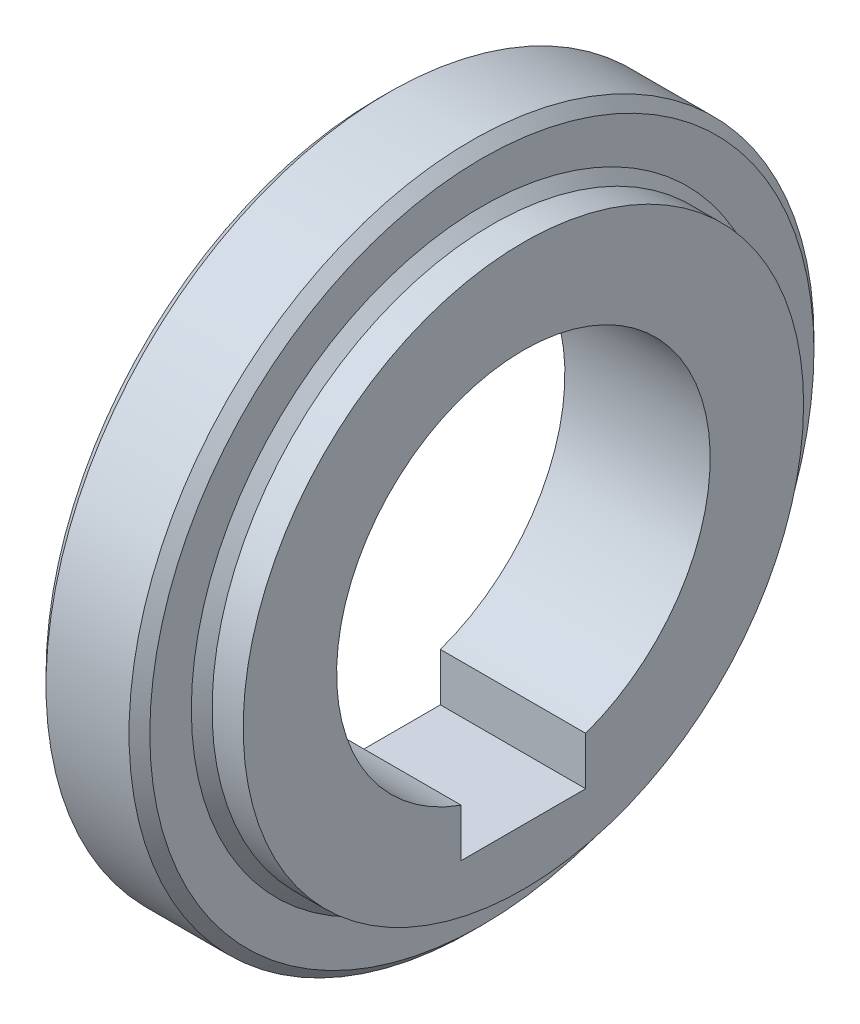
ISO-10303-21;
HEADER;
FILE_DESCRIPTION(('STEP AP214'),'2;1');
FILE_NAME('part.step','',(''),(''),'','','');
FILE_SCHEMA(('AUTOMOTIVE_DESIGN { 1 0 10303 214 1 1 1 1 }'));
ENDSEC;
DATA;
#1=APPLICATION_CONTEXT('core data for automotive mechanical design processes');
#2=APPLICATION_PROTOCOL_DEFINITION('international standard','automotive_design',2000,#1);
#3=PRODUCT_CONTEXT('',#1,'mechanical');
#4=PRODUCT('Part','Part','',(#3));
#5=PRODUCT_RELATED_PRODUCT_CATEGORY('part','',(#4));
#6=PRODUCT_DEFINITION_FORMATION('','',#4);
#7=PRODUCT_DEFINITION_CONTEXT('part definition',#1,'design');
#8=PRODUCT_DEFINITION('design','',#6,#7);
#9=PRODUCT_DEFINITION_SHAPE('','',#8);
#10=(LENGTH_UNIT() NAMED_UNIT(*) SI_UNIT(.MILLI.,.METRE.));
#11=(NAMED_UNIT(*) PLANE_ANGLE_UNIT() SI_UNIT($,.RADIAN.));
#12=(NAMED_UNIT(*) SI_UNIT($,.STERADIAN.) SOLID_ANGLE_UNIT());
#13=UNCERTAINTY_MEASURE_WITH_UNIT(LENGTH_MEASURE(1.E-05),#10,'distance_accuracy_value','');
#14=(GEOMETRIC_REPRESENTATION_CONTEXT(3) GLOBAL_UNCERTAINTY_ASSIGNED_CONTEXT((#13)) GLOBAL_UNIT_ASSIGNED_CONTEXT((#10,
#11,#12)) REPRESENTATION_CONTEXT('',''));
#15=CARTESIAN_POINT('',(0.,0.,0.));
#16=DIRECTION('',(0.,0.,1.));
#17=DIRECTION('',(1.,0.,0.));
#18=AXIS2_PLACEMENT_3D('',#15,#16,#17);
#19=CARTESIAN_POINT('',(0.,0.,0.));
#20=DIRECTION('',(1.,0.,0.));
#21=DIRECTION('',(0.,0.,-1.));
#22=AXIS2_PLACEMENT_3D('',#19,#20,#21);
#23=PLANE('',#22);
#24=CARTESIAN_POINT('',(0.,0.,0.));
#25=DIRECTION('',(1.,0.,0.));
#26=DIRECTION('',(0.,0.,-1.));
#27=AXIS2_PLACEMENT_3D('',#24,#25,#26);
#28=CIRCLE('',#27,16.);
#29=CARTESIAN_POINT('',(0.,0.,-16.));
#30=VERTEX_POINT('',#29);
#31=EDGE_CURVE('E93',#30,#30,#28,.F.);
#32=ORIENTED_EDGE('',*,*,#31,.T.);
#33=EDGE_LOOP('',(#32));
#34=FACE_BOUND('',#33,.T.);
#35=DIRECTION('',(0.,1.,0.));
#36=VECTOR('',#35,1.);
#37=CARTESIAN_POINT('',(0.,0.,-3.));
#38=LINE('',#37,#36);
#39=CARTESIAN_POINT('',(0.,-10.8,-3.));
#40=VERTEX_POINT('',#39);
#41=CARTESIAN_POINT('',(0.,-8.48528137423857,-3.));
#42=VERTEX_POINT('',#41);
#43=EDGE_CURVE('E60',#40,#42,#38,.T.);
#44=ORIENTED_EDGE('',*,*,#43,.T.);
#45=CARTESIAN_POINT('',(0.,0.,0.));
#46=DIRECTION('',(1.,0.,0.));
#47=DIRECTION('',(0.,0.,-1.));
#48=AXIS2_PLACEMENT_3D('',#45,#46,#47);
#49=CIRCLE('',#48,9.);
#50=CARTESIAN_POINT('',(0.,-8.48528137423857,3.));
#51=VERTEX_POINT('',#50);
#52=EDGE_CURVE('E71',#42,#51,#49,.T.);
#53=ORIENTED_EDGE('',*,*,#52,.T.);
#54=DIRECTION('',(0.,1.,0.));
#55=VECTOR('',#54,1.);
#56=CARTESIAN_POINT('',(0.,0.,3.));
#57=LINE('',#56,#55);
#58=CARTESIAN_POINT('',(0.,-10.8,3.));
#59=VERTEX_POINT('',#58);
#60=EDGE_CURVE('E32',#59,#51,#57,.T.);
#61=ORIENTED_EDGE('',*,*,#60,.F.);
#62=DIRECTION('',(0.,0.,1.));
#63=VECTOR('',#62,1.);
#64=CARTESIAN_POINT('',(0.,-10.8,0.));
#65=LINE('',#64,#63);
#66=EDGE_CURVE('E63',#40,#59,#65,.T.);
#67=ORIENTED_EDGE('',*,*,#66,.F.);
#68=EDGE_LOOP('',(#44,#53,#61,#67));
#69=FACE_BOUND('',#68,.T.);
#70=ADVANCED_FACE('F17',(#34,#69),#23,.F.);
#71=CARTESIAN_POINT('',(7.,0.,0.));
#72=DIRECTION('',(1.,0.,0.));
#73=DIRECTION('',(0.,0.,-1.));
#74=AXIS2_PLACEMENT_3D('',#71,#72,#73);
#75=PLANE('',#74);
#76=CARTESIAN_POINT('',(7.,0.,0.));
#77=DIRECTION('',(1.,0.,0.));
#78=DIRECTION('',(0.,0.,-1.));
#79=AXIS2_PLACEMENT_3D('',#76,#77,#78);
#80=CIRCLE('',#79,13.5);
#81=CARTESIAN_POINT('',(7.,0.,-13.5));
#82=VERTEX_POINT('',#81);
#83=EDGE_CURVE('E82',#82,#82,#80,.T.);
#84=ORIENTED_EDGE('',*,*,#83,.T.);
#85=EDGE_LOOP('',(#84));
#86=FACE_BOUND('',#85,.T.);
#87=CARTESIAN_POINT('',(7.,0.,0.));
#88=DIRECTION('',(1.,0.,0.));
#89=DIRECTION('',(0.,0.,-1.));
#90=AXIS2_PLACEMENT_3D('',#87,#88,#89);
#91=CIRCLE('',#90,9.);
#92=CARTESIAN_POINT('',(7.,-8.48528137423857,-3.));
#93=VERTEX_POINT('',#92);
#94=CARTESIAN_POINT('',(7.,-8.48528137423857,3.));
#95=VERTEX_POINT('',#94);
#96=EDGE_CURVE('E80',#93,#95,#91,.T.);
#97=ORIENTED_EDGE('',*,*,#96,.F.);
#98=DIRECTION('',(0.,-1.,0.));
#99=VECTOR('',#98,1.);
#100=CARTESIAN_POINT('',(7.,0.,-3.));
#101=LINE('',#100,#99);
#102=CARTESIAN_POINT('',(7.,-10.8,-3.));
#103=VERTEX_POINT('',#102);
#104=EDGE_CURVE('E77',#93,#103,#101,.T.);
#105=ORIENTED_EDGE('',*,*,#104,.T.);
#106=DIRECTION('',(0.,0.,-1.));
#107=VECTOR('',#106,1.);
#108=CARTESIAN_POINT('',(7.,-10.8,0.));
#109=LINE('',#108,#107);
#110=CARTESIAN_POINT('',(7.,-10.8,3.));
#111=VERTEX_POINT('',#110);
#112=EDGE_CURVE('E11',#111,#103,#109,.T.);
#113=ORIENTED_EDGE('',*,*,#112,.F.);
#114=DIRECTION('',(0.,-1.,0.));
#115=VECTOR('',#114,1.);
#116=CARTESIAN_POINT('',(7.,0.,3.));
#117=LINE('',#116,#115);
#118=EDGE_CURVE('E58',#95,#111,#117,.T.);
#119=ORIENTED_EDGE('',*,*,#118,.F.);
#120=EDGE_LOOP('',(#97,#105,#113,#119));
#121=FACE_BOUND('',#120,.T.);
#122=ADVANCED_FACE('F113',(#86,#121),#75,.T.);
#123=CARTESIAN_POINT('',(0.,0.,0.));
#124=DIRECTION('',(1.,0.,0.));
#125=DIRECTION('',(0.,0.,-1.));
#126=AXIS2_PLACEMENT_3D('',#123,#124,#125);
#127=CYLINDRICAL_SURFACE('',#126,9.);
#128=DIRECTION('',(1.,0.,0.));
#129=VECTOR('',#128,1.);
#130=CARTESIAN_POINT('',(0.,-8.48528137423857,-3.));
#131=LINE('',#130,#129);
#132=EDGE_CURVE('E25',#93,#42,#131,.F.);
#133=ORIENTED_EDGE('',*,*,#132,.F.);
#134=ORIENTED_EDGE('',*,*,#96,.T.);
#135=DIRECTION('',(1.,0.,0.));
#136=VECTOR('',#135,1.);
#137=CARTESIAN_POINT('',(0.,-8.48528137423857,3.));
#138=LINE('',#137,#136);
#139=EDGE_CURVE('E105',#95,#51,#138,.F.);
#140=ORIENTED_EDGE('',*,*,#139,.T.);
#141=ORIENTED_EDGE('',*,*,#52,.F.);
#142=EDGE_LOOP('',(#133,#134,#140,#141));
#143=FACE_BOUND('',#142,.T.);
#144=ADVANCED_FACE('F111',(#143),#127,.F.);
#145=CARTESIAN_POINT('',(5.,0.,0.));
#146=DIRECTION('',(-1.,0.,0.));
#147=DIRECTION('',(0.,0.,1.));
#148=AXIS2_PLACEMENT_3D('',#145,#146,#147);
#149=CYLINDRICAL_SURFACE('',#148,16.5);
#150=CARTESIAN_POINT('',(0.5,0.,0.));
#151=DIRECTION('',(1.,0.,0.));
#152=DIRECTION('',(0.,0.,-1.));
#153=AXIS2_PLACEMENT_3D('',#150,#151,#152);
#154=CIRCLE('',#153,16.5);
#155=CARTESIAN_POINT('',(0.5,0.,-16.5));
#156=VERTEX_POINT('',#155);
#157=EDGE_CURVE('E90',#156,#156,#154,.T.);
#158=ORIENTED_EDGE('',*,*,#157,.T.);
#159=EDGE_LOOP('',(#158));
#160=FACE_BOUND('',#159,.T.);
#161=CARTESIAN_POINT('',(4.5,0.,0.));
#162=DIRECTION('',(1.,0.,0.));
#163=DIRECTION('',(0.,0.,-1.));
#164=AXIS2_PLACEMENT_3D('',#161,#162,#163);
#165=CIRCLE('',#164,16.5);
#166=CARTESIAN_POINT('',(4.5,0.,-16.5));
#167=VERTEX_POINT('',#166);
#168=EDGE_CURVE('E87',#167,#167,#165,.F.);
#169=ORIENTED_EDGE('',*,*,#168,.T.);
#170=EDGE_LOOP('',(#169));
#171=FACE_BOUND('',#170,.T.);
#172=ADVANCED_FACE('F123',(#160,#171),#149,.T.);
#173=CARTESIAN_POINT('',(5.,0.,0.));
#174=DIRECTION('',(1.,0.,0.));
#175=DIRECTION('',(0.,0.,-1.));
#176=AXIS2_PLACEMENT_3D('',#173,#174,#175);
#177=PLANE('',#176);
#178=CARTESIAN_POINT('',(5.,0.,0.));
#179=DIRECTION('',(1.,0.,0.));
#180=DIRECTION('',(0.,0.,-1.));
#181=AXIS2_PLACEMENT_3D('',#178,#179,#180);
#182=CIRCLE('',#181,16.);
#183=CARTESIAN_POINT('',(5.,0.,-16.));
#184=VERTEX_POINT('',#183);
#185=EDGE_CURVE('E99',#184,#184,#182,.T.);
#186=ORIENTED_EDGE('',*,*,#185,.T.);
#187=EDGE_LOOP('',(#186));
#188=FACE_BOUND('',#187,.T.);
#189=CARTESIAN_POINT('',(5.,0.,0.));
#190=DIRECTION('',(1.,0.,0.));
#191=DIRECTION('',(0.,0.,-1.));
#192=AXIS2_PLACEMENT_3D('',#189,#190,#191);
#193=CIRCLE('',#192,14.);
#194=CARTESIAN_POINT('',(5.,0.,-14.));
#195=VERTEX_POINT('',#194);
#196=EDGE_CURVE('E96',#195,#195,#193,.F.);
#197=ORIENTED_EDGE('',*,*,#196,.T.);
#198=EDGE_LOOP('',(#197));
#199=FACE_BOUND('',#198,.T.);
#200=ADVANCED_FACE('F133',(#188,#199),#177,.T.);
#201=CARTESIAN_POINT('',(7.,0.,0.));
#202=DIRECTION('',(-1.,0.,0.));
#203=DIRECTION('',(0.,0.,1.));
#204=AXIS2_PLACEMENT_3D('',#201,#202,#203);
#205=CYLINDRICAL_SURFACE('',#204,13.5);
#206=CARTESIAN_POINT('',(5.5,0.,0.));
#207=DIRECTION('',(1.,0.,0.));
#208=DIRECTION('',(0.,0.,-1.));
#209=AXIS2_PLACEMENT_3D('',#206,#207,#208);
#210=CIRCLE('',#209,13.5);
#211=CARTESIAN_POINT('',(5.5,0.,-13.5));
#212=VERTEX_POINT('',#211);
#213=EDGE_CURVE('E102',#212,#212,#210,.T.);
#214=ORIENTED_EDGE('',*,*,#213,.T.);
#215=EDGE_LOOP('',(#214));
#216=FACE_BOUND('',#215,.T.);
#217=ORIENTED_EDGE('',*,*,#83,.F.);
#218=EDGE_LOOP('',(#217));
#219=FACE_BOUND('',#218,.T.);
#220=ADVANCED_FACE('F129',(#216,#219),#205,.T.);
#221=CARTESIAN_POINT('',(0.5,0.,0.));
#222=DIRECTION('',(1.,0.,0.));
#223=DIRECTION('',(0.,0.,-1.));
#224=AXIS2_PLACEMENT_3D('',#221,#222,#223);
#225=CONICAL_SURFACE('',#224,16.5,0.785398163397455);
#226=ORIENTED_EDGE('',*,*,#31,.F.);
#227=EDGE_LOOP('',(#226));
#228=FACE_BOUND('',#227,.T.);
#229=ORIENTED_EDGE('',*,*,#157,.F.);
#230=EDGE_LOOP('',(#229));
#231=FACE_BOUND('',#230,.T.);
#232=ADVANCED_FACE('F132',(#228,#231),#225,.T.);
#233=CARTESIAN_POINT('',(5.,0.,0.));
#234=DIRECTION('',(-1.,0.,0.));
#235=DIRECTION('',(0.,0.,1.));
#236=AXIS2_PLACEMENT_3D('',#233,#234,#235);
#237=CONICAL_SURFACE('',#236,16.,0.785398163397438);
#238=ORIENTED_EDGE('',*,*,#168,.F.);
#239=EDGE_LOOP('',(#238));
#240=FACE_BOUND('',#239,.T.);
#241=ORIENTED_EDGE('',*,*,#185,.F.);
#242=EDGE_LOOP('',(#241));
#243=FACE_BOUND('',#242,.T.);
#244=ADVANCED_FACE('F142',(#240,#243),#237,.T.);
#245=CARTESIAN_POINT('',(5.5,0.,0.));
#246=DIRECTION('',(-1.,0.,0.));
#247=DIRECTION('',(0.,0.,1.));
#248=AXIS2_PLACEMENT_3D('',#245,#246,#247);
#249=CONICAL_SURFACE('',#248,13.5,0.785398163397441);
#250=ORIENTED_EDGE('',*,*,#196,.F.);
#251=EDGE_LOOP('',(#250));
#252=FACE_BOUND('',#251,.T.);
#253=ORIENTED_EDGE('',*,*,#213,.F.);
#254=EDGE_LOOP('',(#253));
#255=FACE_BOUND('',#254,.T.);
#256=ADVANCED_FACE('F19',(#252,#255),#249,.T.);
#257=CARTESIAN_POINT('',(10.,-10.8,0.));
#258=DIRECTION('',(0.,-1.,0.));
#259=DIRECTION('',(0.,0.,-1.));
#260=AXIS2_PLACEMENT_3D('',#257,#258,#259);
#261=PLANE('',#260);
#262=ORIENTED_EDGE('',*,*,#112,.T.);
#263=DIRECTION('',(-1.,0.,0.));
#264=VECTOR('',#263,1.);
#265=CARTESIAN_POINT('',(10.,-10.8,-3.));
#266=LINE('',#265,#264);
#267=EDGE_CURVE('E59',#103,#40,#266,.T.);
#268=ORIENTED_EDGE('',*,*,#267,.T.);
#269=ORIENTED_EDGE('',*,*,#66,.T.);
#270=DIRECTION('',(-1.,0.,0.));
#271=VECTOR('',#270,1.);
#272=CARTESIAN_POINT('',(10.,-10.8,3.));
#273=LINE('',#272,#271);
#274=EDGE_CURVE('E54',#111,#59,#273,.T.);
#275=ORIENTED_EDGE('',*,*,#274,.F.);
#276=EDGE_LOOP('',(#262,#268,#269,#275));
#277=FACE_BOUND('',#276,.T.);
#278=ADVANCED_FACE('F64',(#277),#261,.F.);
#279=CARTESIAN_POINT('',(10.,0.,-3.));
#280=DIRECTION('',(0.,0.,1.));
#281=DIRECTION('',(1.,0.,0.));
#282=AXIS2_PLACEMENT_3D('',#279,#280,#281);
#283=PLANE('',#282);
#284=ORIENTED_EDGE('',*,*,#132,.T.);
#285=ORIENTED_EDGE('',*,*,#43,.F.);
#286=ORIENTED_EDGE('',*,*,#267,.F.);
#287=ORIENTED_EDGE('',*,*,#104,.F.);
#288=EDGE_LOOP('',(#284,#285,#286,#287));
#289=FACE_BOUND('',#288,.T.);
#290=ADVANCED_FACE('F108',(#289),#283,.T.);
#291=CARTESIAN_POINT('',(10.,0.,3.));
#292=DIRECTION('',(0.,0.,1.));
#293=DIRECTION('',(1.,0.,0.));
#294=AXIS2_PLACEMENT_3D('',#291,#292,#293);
#295=PLANE('',#294);
#296=ORIENTED_EDGE('',*,*,#118,.T.);
#297=ORIENTED_EDGE('',*,*,#274,.T.);
#298=ORIENTED_EDGE('',*,*,#60,.T.);
#299=ORIENTED_EDGE('',*,*,#139,.F.);
#300=EDGE_LOOP('',(#296,#297,#298,#299));
#301=FACE_BOUND('',#300,.T.);
#302=ADVANCED_FACE('F56',(#301),#295,.F.);
#303=CLOSED_SHELL('',(#70,#122,#144,#172,#200,#220,#232,#244,#256,#278,#290,#302));
#304=MANIFOLD_SOLID_BREP('B1',#303);
#305=ADVANCED_BREP_SHAPE_REPRESENTATION('',(#18,#304),#14);
#306=SHAPE_DEFINITION_REPRESENTATION(#9,#305);
ENDSEC;
END-ISO-10303-21;
